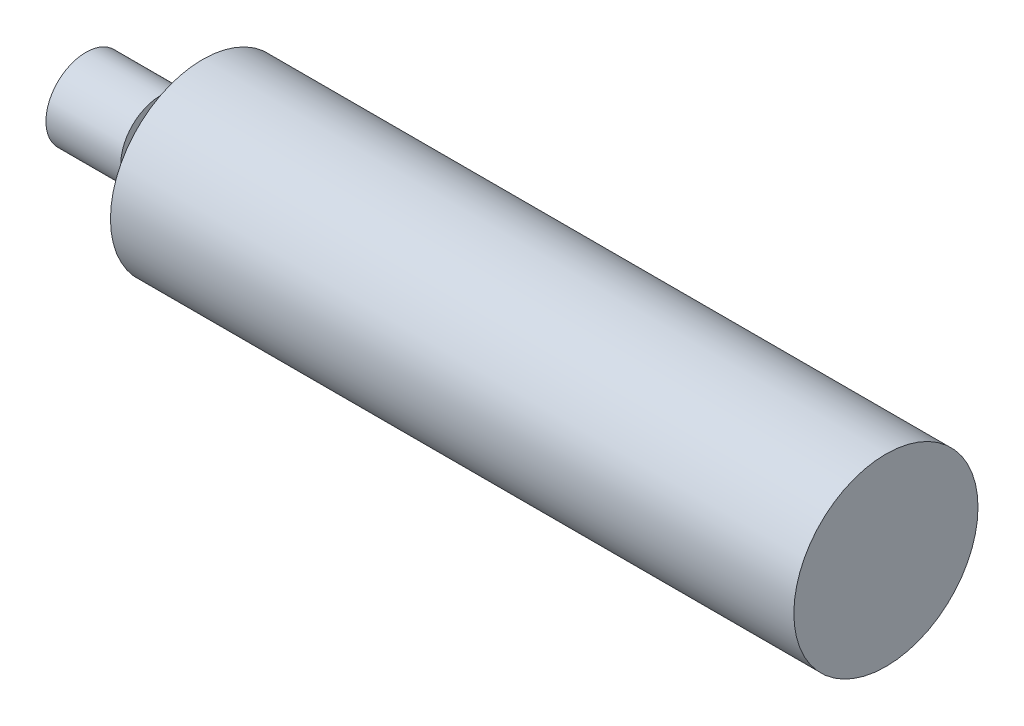
ISO-10303-21;
HEADER;
FILE_DESCRIPTION(('STEP AP214'),'2;1');
FILE_NAME('part.step','',(''),(''),'','','');
FILE_SCHEMA(('AUTOMOTIVE_DESIGN { 1 0 10303 214 1 1 1 1 }'));
ENDSEC;
DATA;
#1=APPLICATION_CONTEXT('core data for automotive mechanical design processes');
#2=APPLICATION_PROTOCOL_DEFINITION('international standard','automotive_design',2000,#1);
#3=PRODUCT_CONTEXT('',#1,'mechanical');
#4=PRODUCT('Part','Part','',(#3));
#5=PRODUCT_RELATED_PRODUCT_CATEGORY('part','',(#4));
#6=PRODUCT_DEFINITION_FORMATION('','',#4);
#7=PRODUCT_DEFINITION_CONTEXT('part definition',#1,'design');
#8=PRODUCT_DEFINITION('design','',#6,#7);
#9=PRODUCT_DEFINITION_SHAPE('','',#8);
#10=(LENGTH_UNIT() NAMED_UNIT(*) SI_UNIT(.MILLI.,.METRE.));
#11=(NAMED_UNIT(*) PLANE_ANGLE_UNIT() SI_UNIT($,.RADIAN.));
#12=(NAMED_UNIT(*) SI_UNIT($,.STERADIAN.) SOLID_ANGLE_UNIT());
#13=UNCERTAINTY_MEASURE_WITH_UNIT(LENGTH_MEASURE(1.E-05),#10,'distance_accuracy_value','');
#14=(GEOMETRIC_REPRESENTATION_CONTEXT(3) GLOBAL_UNCERTAINTY_ASSIGNED_CONTEXT((#13)) GLOBAL_UNIT_ASSIGNED_CONTEXT((#10,
#11,#12)) REPRESENTATION_CONTEXT('',''));
#15=CARTESIAN_POINT('',(0.,0.,0.));
#16=DIRECTION('',(0.,0.,1.));
#17=DIRECTION('',(1.,0.,0.));
#18=AXIS2_PLACEMENT_3D('',#15,#16,#17);
#19=CARTESIAN_POINT('',(95.456,0.,0.));
#20=DIRECTION('',(1.,0.,0.));
#21=DIRECTION('',(0.,0.,-1.));
#22=AXIS2_PLACEMENT_3D('',#19,#20,#21);
#23=PLANE('',#22);
#24=CARTESIAN_POINT('',(95.456,0.,0.));
#25=DIRECTION('',(1.,0.,0.));
#26=DIRECTION('',(0.,0.,-1.));
#27=AXIS2_PLACEMENT_3D('',#24,#25,#26);
#28=CIRCLE('',#27,10.9855);
#29=CARTESIAN_POINT('',(95.456,0.,-10.9855));
#30=VERTEX_POINT('',#29);
#31=EDGE_CURVE('E10',#30,#30,#28,.T.);
#32=ORIENTED_EDGE('',*,*,#31,.T.);
#33=EDGE_LOOP('',(#32));
#34=FACE_BOUND('',#33,.T.);
#35=ADVANCED_FACE('F39',(#34),#23,.T.);
#36=CARTESIAN_POINT('',(95.456,0.,0.));
#37=DIRECTION('',(1.,0.,0.));
#38=DIRECTION('',(0.,0.,-1.));
#39=AXIS2_PLACEMENT_3D('',#36,#37,#38);
#40=CYLINDRICAL_SURFACE('',#39,10.9855);
#41=CARTESIAN_POINT('',(13.922,0.,0.));
#42=DIRECTION('',(1.,0.,0.));
#43=DIRECTION('',(0.,0.,-1.));
#44=AXIS2_PLACEMENT_3D('',#41,#42,#43);
#45=CIRCLE('',#44,10.9855);
#46=CARTESIAN_POINT('',(13.922,0.,-10.9855));
#47=VERTEX_POINT('',#46);
#48=EDGE_CURVE('E46',#47,#47,#45,.T.);
#49=ORIENTED_EDGE('',*,*,#48,.T.);
#50=EDGE_LOOP('',(#49));
#51=FACE_BOUND('',#50,.T.);
#52=ORIENTED_EDGE('',*,*,#31,.F.);
#53=EDGE_LOOP('',(#52));
#54=FACE_BOUND('',#53,.T.);
#55=ADVANCED_FACE('F91',(#51,#54),#40,.T.);
#56=CARTESIAN_POINT('',(13.922,0.,-6.00709999999999));
#57=DIRECTION('',(-1.,0.,0.));
#58=DIRECTION('',(0.,0.,1.));
#59=AXIS2_PLACEMENT_3D('',#56,#57,#58);
#60=PLANE('',#59);
#61=CARTESIAN_POINT('',(13.922,0.,0.));
#62=DIRECTION('',(1.,0.,0.));
#63=DIRECTION('',(0.,0.,-1.));
#64=AXIS2_PLACEMENT_3D('',#61,#62,#63);
#65=CIRCLE('',#64,6.00709999999999);
#66=CARTESIAN_POINT('',(13.922,0.,-6.00709999999999));
#67=VERTEX_POINT('',#66);
#68=EDGE_CURVE('E51',#67,#67,#65,.T.);
#69=ORIENTED_EDGE('',*,*,#68,.T.);
#70=EDGE_LOOP('',(#69));
#71=FACE_BOUND('',#70,.T.);
#72=ORIENTED_EDGE('',*,*,#48,.F.);
#73=EDGE_LOOP('',(#72));
#74=FACE_BOUND('',#73,.T.);
#75=ADVANCED_FACE('F95',(#71,#74),#60,.T.);
#76=CARTESIAN_POINT('',(95.456,0.,0.));
#77=DIRECTION('',(1.,0.,0.));
#78=DIRECTION('',(0.,0.,-1.));
#79=AXIS2_PLACEMENT_3D('',#76,#77,#78);
#80=CYLINDRICAL_SURFACE('',#79,6.00709999999999);
#81=CARTESIAN_POINT('',(10.922,0.,0.));
#82=DIRECTION('',(1.,0.,0.));
#83=DIRECTION('',(0.,0.,-1.));
#84=AXIS2_PLACEMENT_3D('',#81,#82,#83);
#85=CIRCLE('',#84,6.00709999999999);
#86=CARTESIAN_POINT('',(10.922,0.,-6.00709999999999));
#87=VERTEX_POINT('',#86);
#88=EDGE_CURVE('E56',#87,#87,#85,.T.);
#89=ORIENTED_EDGE('',*,*,#88,.T.);
#90=EDGE_LOOP('',(#89));
#91=FACE_BOUND('',#90,.T.);
#92=ORIENTED_EDGE('',*,*,#68,.F.);
#93=EDGE_LOOP('',(#92));
#94=FACE_BOUND('',#93,.T.);
#95=ADVANCED_FACE('F99',(#91,#94),#80,.T.);
#96=CARTESIAN_POINT('',(10.922,0.,-2.99719999999999));
#97=DIRECTION('',(-1.,0.,0.));
#98=DIRECTION('',(0.,0.,1.));
#99=AXIS2_PLACEMENT_3D('',#96,#97,#98);
#100=PLANE('',#99);
#101=CARTESIAN_POINT('',(10.922,0.,0.));
#102=DIRECTION('',(1.,0.,0.));
#103=DIRECTION('',(0.,0.,-1.));
#104=AXIS2_PLACEMENT_3D('',#101,#102,#103);
#105=CIRCLE('',#104,2.99719999999999);
#106=CARTESIAN_POINT('',(10.922,0.,-2.99719999999999));
#107=VERTEX_POINT('',#106);
#108=EDGE_CURVE('E62',#107,#107,#105,.T.);
#109=ORIENTED_EDGE('',*,*,#108,.T.);
#110=EDGE_LOOP('',(#109));
#111=FACE_BOUND('',#110,.T.);
#112=ORIENTED_EDGE('',*,*,#88,.F.);
#113=EDGE_LOOP('',(#112));
#114=FACE_BOUND('',#113,.T.);
#115=ADVANCED_FACE('F106',(#111,#114),#100,.T.);
#116=CARTESIAN_POINT('',(95.456,0.,0.));
#117=DIRECTION('',(1.,0.,0.));
#118=DIRECTION('',(0.,0.,-1.));
#119=AXIS2_PLACEMENT_3D('',#116,#117,#118);
#120=CYLINDRICAL_SURFACE('',#119,2.99719999999999);
#121=CARTESIAN_POINT('',(8.922,0.,0.));
#122=DIRECTION('',(1.,0.,0.));
#123=DIRECTION('',(0.,0.,-1.));
#124=AXIS2_PLACEMENT_3D('',#121,#122,#123);
#125=CIRCLE('',#124,2.99719999999999);
#126=CARTESIAN_POINT('',(8.922,0.,-2.99719999999999));
#127=VERTEX_POINT('',#126);
#128=EDGE_CURVE('E66',#127,#127,#125,.T.);
#129=ORIENTED_EDGE('',*,*,#128,.T.);
#130=EDGE_LOOP('',(#129));
#131=FACE_BOUND('',#130,.T.);
#132=ORIENTED_EDGE('',*,*,#108,.F.);
#133=EDGE_LOOP('',(#132));
#134=FACE_BOUND('',#133,.T.);
#135=ADVANCED_FACE('F110',(#131,#134),#120,.T.);
#136=CARTESIAN_POINT('',(8.922,0.,-4.76249999999999));
#137=DIRECTION('',(1.,0.,0.));
#138=DIRECTION('',(0.,0.,-1.));
#139=AXIS2_PLACEMENT_3D('',#136,#137,#138);
#140=PLANE('',#139);
#141=CARTESIAN_POINT('',(8.922,0.,0.));
#142=DIRECTION('',(1.,0.,0.));
#143=DIRECTION('',(0.,0.,-1.));
#144=AXIS2_PLACEMENT_3D('',#141,#142,#143);
#145=CIRCLE('',#144,4.76249999999999);
#146=CARTESIAN_POINT('',(8.922,0.,-4.76249999999999));
#147=VERTEX_POINT('',#146);
#148=EDGE_CURVE('E70',#147,#147,#145,.T.);
#149=ORIENTED_EDGE('',*,*,#148,.T.);
#150=EDGE_LOOP('',(#149));
#151=FACE_BOUND('',#150,.T.);
#152=ORIENTED_EDGE('',*,*,#128,.F.);
#153=EDGE_LOOP('',(#152));
#154=FACE_BOUND('',#153,.T.);
#155=ADVANCED_FACE('F88',(#151,#154),#140,.T.);
#156=CARTESIAN_POINT('',(95.456,0.,0.));
#157=DIRECTION('',(1.,0.,0.));
#158=DIRECTION('',(0.,0.,-1.));
#159=AXIS2_PLACEMENT_3D('',#156,#157,#158);
#160=CYLINDRICAL_SURFACE('',#159,4.76249999999999);
#161=CARTESIAN_POINT('',(0.,0.,0.));
#162=DIRECTION('',(1.,0.,0.));
#163=DIRECTION('',(0.,0.,-1.));
#164=AXIS2_PLACEMENT_3D('',#161,#162,#163);
#165=CIRCLE('',#164,4.7625);
#166=CARTESIAN_POINT('',(0.,0.,-4.7625));
#167=VERTEX_POINT('',#166);
#168=EDGE_CURVE('E74',#167,#167,#165,.T.);
#169=ORIENTED_EDGE('',*,*,#168,.T.);
#170=EDGE_LOOP('',(#169));
#171=FACE_BOUND('',#170,.T.);
#172=ORIENTED_EDGE('',*,*,#148,.F.);
#173=EDGE_LOOP('',(#172));
#174=FACE_BOUND('',#173,.T.);
#175=ADVANCED_FACE('F79',(#171,#174),#160,.T.);
#176=CARTESIAN_POINT('',(0.,0.,0.));
#177=DIRECTION('',(-1.,0.,0.));
#178=DIRECTION('',(0.,0.,1.));
#179=AXIS2_PLACEMENT_3D('',#176,#177,#178);
#180=PLANE('',#179);
#181=ORIENTED_EDGE('',*,*,#168,.F.);
#182=EDGE_LOOP('',(#181));
#183=FACE_BOUND('',#182,.T.);
#184=ADVANCED_FACE('F82',(#183),#180,.T.);
#185=CLOSED_SHELL('',(#35,#55,#75,#95,#115,#135,#155,#175,#184));
#186=MANIFOLD_SOLID_BREP('B2',#185);
#187=ADVANCED_BREP_SHAPE_REPRESENTATION('',(#18,#186),#14);
#188=SHAPE_DEFINITION_REPRESENTATION(#9,#187);
ENDSEC;
END-ISO-10303-21;
